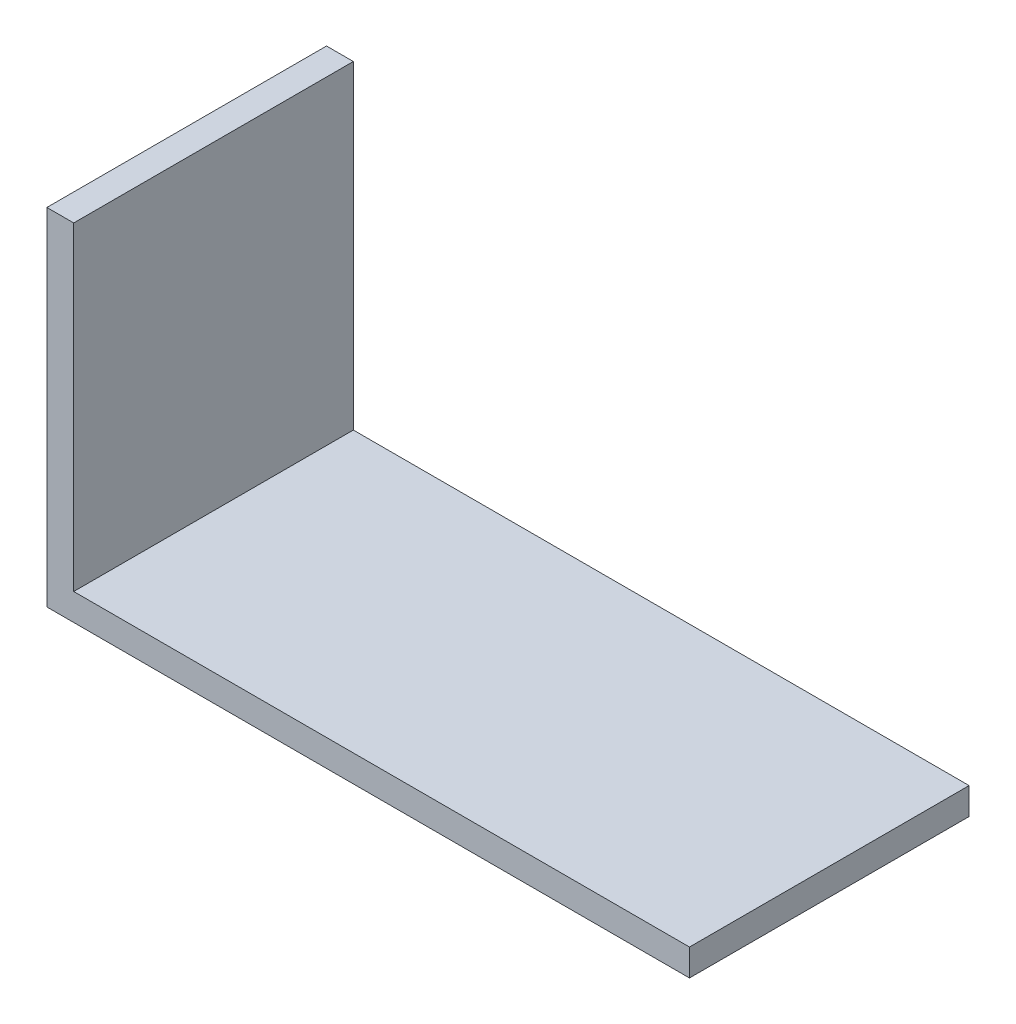
ISO-10303-21;
HEADER;
FILE_DESCRIPTION(('STEP AP214'),'2;1');
FILE_NAME('part.step','',(''),(''),'','','');
FILE_SCHEMA(('AUTOMOTIVE_DESIGN { 1 0 10303 214 1 1 1 1 }'));
ENDSEC;
DATA;
#1=APPLICATION_CONTEXT('core data for automotive mechanical design processes');
#2=APPLICATION_PROTOCOL_DEFINITION('international standard','automotive_design',2000,#1);
#3=PRODUCT_CONTEXT('',#1,'mechanical');
#4=PRODUCT('Part','Part','',(#3));
#5=PRODUCT_RELATED_PRODUCT_CATEGORY('part','',(#4));
#6=PRODUCT_DEFINITION_FORMATION('','',#4);
#7=PRODUCT_DEFINITION_CONTEXT('part definition',#1,'design');
#8=PRODUCT_DEFINITION('design','',#6,#7);
#9=PRODUCT_DEFINITION_SHAPE('','',#8);
#10=(LENGTH_UNIT() NAMED_UNIT(*) SI_UNIT(.MILLI.,.METRE.));
#11=(NAMED_UNIT(*) PLANE_ANGLE_UNIT() SI_UNIT($,.RADIAN.));
#12=(NAMED_UNIT(*) SI_UNIT($,.STERADIAN.) SOLID_ANGLE_UNIT());
#13=UNCERTAINTY_MEASURE_WITH_UNIT(LENGTH_MEASURE(1.E-05),#10,'distance_accuracy_value','');
#14=(GEOMETRIC_REPRESENTATION_CONTEXT(3) GLOBAL_UNCERTAINTY_ASSIGNED_CONTEXT((#13)) GLOBAL_UNIT_ASSIGNED_CONTEXT((#10,
#11,#12)) REPRESENTATION_CONTEXT('',''));
#15=CARTESIAN_POINT('',(0.,0.,0.));
#16=DIRECTION('',(0.,0.,1.));
#17=DIRECTION('',(1.,0.,0.));
#18=AXIS2_PLACEMENT_3D('',#15,#16,#17);
#19=CARTESIAN_POINT('',(19.,0.,198.));
#20=DIRECTION('',(-1.,0.,0.));
#21=DIRECTION('',(0.,0.,1.));
#22=AXIS2_PLACEMENT_3D('',#19,#20,#21);
#23=PLANE('',#22);
#24=DIRECTION('',(0.,1.,0.));
#25=VECTOR('',#24,1.);
#26=CARTESIAN_POINT('',(19.,0.,0.));
#27=LINE('',#26,#25);
#28=CARTESIAN_POINT('',(19.,19.,0.));
#29=VERTEX_POINT('',#28);
#30=CARTESIAN_POINT('',(19.,245.,0.));
#31=VERTEX_POINT('',#30);
#32=EDGE_CURVE('E117',#29,#31,#27,.T.);
#33=ORIENTED_EDGE('',*,*,#32,.T.);
#34=DIRECTION('',(0.,0.,-1.));
#35=VECTOR('',#34,1.);
#36=CARTESIAN_POINT('',(19.,245.,198.));
#37=LINE('',#36,#35);
#38=CARTESIAN_POINT('',(19.,245.,198.));
#39=VERTEX_POINT('',#38);
#40=EDGE_CURVE('E11',#39,#31,#37,.T.);
#41=ORIENTED_EDGE('',*,*,#40,.F.);
#42=DIRECTION('',(0.,1.,0.));
#43=VECTOR('',#42,1.);
#44=CARTESIAN_POINT('',(19.,0.,198.));
#45=LINE('',#44,#43);
#46=CARTESIAN_POINT('',(19.,19.,198.));
#47=VERTEX_POINT('',#46);
#48=EDGE_CURVE('E82',#47,#39,#45,.T.);
#49=ORIENTED_EDGE('',*,*,#48,.F.);
#50=DIRECTION('',(0.,0.,-1.));
#51=VECTOR('',#50,1.);
#52=CARTESIAN_POINT('',(19.,19.,198.));
#53=LINE('',#52,#51);
#54=EDGE_CURVE('E113',#47,#29,#53,.T.);
#55=ORIENTED_EDGE('',*,*,#54,.T.);
#56=EDGE_LOOP('',(#33,#41,#49,#55));
#57=FACE_BOUND('',#56,.T.);
#58=ADVANCED_FACE('F36',(#57),#23,.F.);
#59=CARTESIAN_POINT('',(0.,245.,198.));
#60=DIRECTION('',(0.,1.,0.));
#61=DIRECTION('',(0.,0.,1.));
#62=AXIS2_PLACEMENT_3D('',#59,#60,#61);
#63=PLANE('',#62);
#64=DIRECTION('',(1.,0.,0.));
#65=VECTOR('',#64,1.);
#66=CARTESIAN_POINT('',(0.,245.,0.));
#67=LINE('',#66,#65);
#68=CARTESIAN_POINT('',(0.,245.,0.));
#69=VERTEX_POINT('',#68);
#70=EDGE_CURVE('E120',#69,#31,#67,.T.);
#71=ORIENTED_EDGE('',*,*,#70,.F.);
#72=DIRECTION('',(0.,0.,-1.));
#73=VECTOR('',#72,1.);
#74=CARTESIAN_POINT('',(0.,245.,198.));
#75=LINE('',#74,#73);
#76=CARTESIAN_POINT('',(0.,245.,198.));
#77=VERTEX_POINT('',#76);
#78=EDGE_CURVE('E44',#77,#69,#75,.T.);
#79=ORIENTED_EDGE('',*,*,#78,.F.);
#80=DIRECTION('',(1.,0.,0.));
#81=VECTOR('',#80,1.);
#82=CARTESIAN_POINT('',(0.,245.,198.));
#83=LINE('',#82,#81);
#84=EDGE_CURVE('E206',#77,#39,#83,.T.);
#85=ORIENTED_EDGE('',*,*,#84,.T.);
#86=ORIENTED_EDGE('',*,*,#40,.T.);
#87=EDGE_LOOP('',(#71,#79,#85,#86));
#88=FACE_BOUND('',#87,.T.);
#89=ADVANCED_FACE('F138',(#88),#63,.T.);
#90=CARTESIAN_POINT('',(0.,0.,198.));
#91=DIRECTION('',(-1.,0.,0.));
#92=DIRECTION('',(0.,0.,1.));
#93=AXIS2_PLACEMENT_3D('',#90,#91,#92);
#94=PLANE('',#93);
#95=DIRECTION('',(0.,1.,0.));
#96=VECTOR('',#95,1.);
#97=CARTESIAN_POINT('',(0.,0.,0.));
#98=LINE('',#97,#96);
#99=CARTESIAN_POINT('',(0.,0.,0.));
#100=VERTEX_POINT('',#99);
#101=EDGE_CURVE('E123',#100,#69,#98,.T.);
#102=ORIENTED_EDGE('',*,*,#101,.F.);
#103=DIRECTION('',(0.,0.,-1.));
#104=VECTOR('',#103,1.);
#105=CARTESIAN_POINT('',(0.,0.,198.));
#106=LINE('',#105,#104);
#107=CARTESIAN_POINT('',(0.,0.,198.));
#108=VERTEX_POINT('',#107);
#109=EDGE_CURVE('E103',#108,#100,#106,.T.);
#110=ORIENTED_EDGE('',*,*,#109,.F.);
#111=DIRECTION('',(0.,1.,0.));
#112=VECTOR('',#111,1.);
#113=CARTESIAN_POINT('',(0.,0.,198.));
#114=LINE('',#113,#112);
#115=EDGE_CURVE('E109',#108,#77,#114,.T.);
#116=ORIENTED_EDGE('',*,*,#115,.T.);
#117=ORIENTED_EDGE('',*,*,#78,.T.);
#118=EDGE_LOOP('',(#102,#110,#116,#117));
#119=FACE_BOUND('',#118,.T.);
#120=ADVANCED_FACE('F135',(#119),#94,.T.);
#121=CARTESIAN_POINT('',(0.,0.,198.));
#122=DIRECTION('',(0.,-1.,0.));
#123=DIRECTION('',(0.,0.,-1.));
#124=AXIS2_PLACEMENT_3D('',#121,#122,#123);
#125=PLANE('',#124);
#126=DIRECTION('',(-1.,0.,0.));
#127=VECTOR('',#126,1.);
#128=CARTESIAN_POINT('',(0.,0.,0.));
#129=LINE('',#128,#127);
#130=CARTESIAN_POINT('',(455.,0.,0.));
#131=VERTEX_POINT('',#130);
#132=EDGE_CURVE('E98',#131,#100,#129,.T.);
#133=ORIENTED_EDGE('',*,*,#132,.F.);
#134=DIRECTION('',(0.,0.,-1.));
#135=VECTOR('',#134,1.);
#136=CARTESIAN_POINT('',(455.,0.,198.));
#137=LINE('',#136,#135);
#138=CARTESIAN_POINT('',(455.,0.,198.));
#139=VERTEX_POINT('',#138);
#140=EDGE_CURVE('E93',#139,#131,#137,.T.);
#141=ORIENTED_EDGE('',*,*,#140,.F.);
#142=DIRECTION('',(-1.,0.,0.));
#143=VECTOR('',#142,1.);
#144=CARTESIAN_POINT('',(0.,0.,198.));
#145=LINE('',#144,#143);
#146=EDGE_CURVE('E96',#139,#108,#145,.T.);
#147=ORIENTED_EDGE('',*,*,#146,.T.);
#148=ORIENTED_EDGE('',*,*,#109,.T.);
#149=EDGE_LOOP('',(#133,#141,#147,#148));
#150=FACE_BOUND('',#149,.T.);
#151=ADVANCED_FACE('F95',(#150),#125,.T.);
#152=CARTESIAN_POINT('',(455.,19.,198.));
#153=DIRECTION('',(1.,0.,0.));
#154=DIRECTION('',(0.,0.,-1.));
#155=AXIS2_PLACEMENT_3D('',#152,#153,#154);
#156=PLANE('',#155);
#157=DIRECTION('',(0.,-1.,0.));
#158=VECTOR('',#157,1.);
#159=CARTESIAN_POINT('',(455.,19.,0.));
#160=LINE('',#159,#158);
#161=CARTESIAN_POINT('',(455.,19.,0.));
#162=VERTEX_POINT('',#161);
#163=EDGE_CURVE('E127',#162,#131,#160,.T.);
#164=ORIENTED_EDGE('',*,*,#163,.F.);
#165=DIRECTION('',(0.,0.,-1.));
#166=VECTOR('',#165,1.);
#167=CARTESIAN_POINT('',(455.,19.,198.));
#168=LINE('',#167,#166);
#169=CARTESIAN_POINT('',(455.,19.,198.));
#170=VERTEX_POINT('',#169);
#171=EDGE_CURVE('E73',#170,#162,#168,.T.);
#172=ORIENTED_EDGE('',*,*,#171,.F.);
#173=DIRECTION('',(0.,-1.,0.));
#174=VECTOR('',#173,1.);
#175=CARTESIAN_POINT('',(455.,19.,198.));
#176=LINE('',#175,#174);
#177=EDGE_CURVE('E107',#170,#139,#176,.T.);
#178=ORIENTED_EDGE('',*,*,#177,.T.);
#179=ORIENTED_EDGE('',*,*,#140,.T.);
#180=EDGE_LOOP('',(#164,#172,#178,#179));
#181=FACE_BOUND('',#180,.T.);
#182=ADVANCED_FACE('F111',(#181),#156,.T.);
#183=CARTESIAN_POINT('',(0.,19.,198.));
#184=DIRECTION('',(0.,-1.,0.));
#185=DIRECTION('',(0.,0.,-1.));
#186=AXIS2_PLACEMENT_3D('',#183,#184,#185);
#187=PLANE('',#186);
#188=DIRECTION('',(1.,0.,0.));
#189=VECTOR('',#188,1.);
#190=CARTESIAN_POINT('',(0.,19.,0.));
#191=LINE('',#190,#189);
#192=EDGE_CURVE('E76',#162,#29,#191,.F.);
#193=ORIENTED_EDGE('',*,*,#192,.T.);
#194=ORIENTED_EDGE('',*,*,#54,.F.);
#195=DIRECTION('',(1.,0.,0.));
#196=VECTOR('',#195,1.);
#197=CARTESIAN_POINT('',(0.,19.,198.));
#198=LINE('',#197,#196);
#199=EDGE_CURVE('E52',#170,#47,#198,.F.);
#200=ORIENTED_EDGE('',*,*,#199,.F.);
#201=ORIENTED_EDGE('',*,*,#171,.T.);
#202=EDGE_LOOP('',(#193,#194,#200,#201));
#203=FACE_BOUND('',#202,.T.);
#204=ADVANCED_FACE('F143',(#203),#187,.F.);
#205=CARTESIAN_POINT('',(0.,0.,198.));
#206=DIRECTION('',(0.,0.,-1.));
#207=DIRECTION('',(-1.,0.,0.));
#208=AXIS2_PLACEMENT_3D('',#205,#206,#207);
#209=PLANE('',#208);
#210=ORIENTED_EDGE('',*,*,#48,.T.);
#211=ORIENTED_EDGE('',*,*,#84,.F.);
#212=ORIENTED_EDGE('',*,*,#115,.F.);
#213=ORIENTED_EDGE('',*,*,#146,.F.);
#214=ORIENTED_EDGE('',*,*,#177,.F.);
#215=ORIENTED_EDGE('',*,*,#199,.T.);
#216=EDGE_LOOP('',(#210,#211,#212,#213,#214,#215));
#217=FACE_BOUND('',#216,.T.);
#218=ADVANCED_FACE('F106',(#217),#209,.F.);
#219=CARTESIAN_POINT('',(0.,0.,0.));
#220=DIRECTION('',(0.,0.,-1.));
#221=DIRECTION('',(-1.,0.,0.));
#222=AXIS2_PLACEMENT_3D('',#219,#220,#221);
#223=PLANE('',#222);
#224=ORIENTED_EDGE('',*,*,#32,.F.);
#225=ORIENTED_EDGE('',*,*,#192,.F.);
#226=ORIENTED_EDGE('',*,*,#163,.T.);
#227=ORIENTED_EDGE('',*,*,#132,.T.);
#228=ORIENTED_EDGE('',*,*,#101,.T.);
#229=ORIENTED_EDGE('',*,*,#70,.T.);
#230=EDGE_LOOP('',(#224,#225,#226,#227,#228,#229));
#231=FACE_BOUND('',#230,.T.);
#232=ADVANCED_FACE('F141',(#231),#223,.T.);
#233=CLOSED_SHELL('',(#58,#89,#120,#151,#182,#204,#218,#232));
#234=MANIFOLD_SOLID_BREP('B2',#233);
#235=ADVANCED_BREP_SHAPE_REPRESENTATION('',(#18,#234),#14);
#236=SHAPE_DEFINITION_REPRESENTATION(#9,#235);
ENDSEC;
END-ISO-10303-21;
